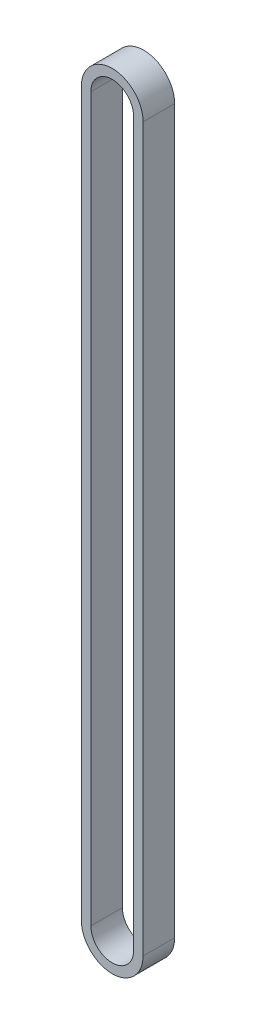
ISO-10303-21;
HEADER;
FILE_DESCRIPTION(('STEP AP214'),'2;1');
FILE_NAME('part.step','',(''),(''),'','','');
FILE_SCHEMA(('AUTOMOTIVE_DESIGN { 1 0 10303 214 1 1 1 1 }'));
ENDSEC;
DATA;
#1=APPLICATION_CONTEXT('core data for automotive mechanical design processes');
#2=APPLICATION_PROTOCOL_DEFINITION('international standard','automotive_design',2000,#1);
#3=PRODUCT_CONTEXT('',#1,'mechanical');
#4=PRODUCT('Part','Part','',(#3));
#5=PRODUCT_RELATED_PRODUCT_CATEGORY('part','',(#4));
#6=PRODUCT_DEFINITION_FORMATION('','',#4);
#7=PRODUCT_DEFINITION_CONTEXT('part definition',#1,'design');
#8=PRODUCT_DEFINITION('design','',#6,#7);
#9=PRODUCT_DEFINITION_SHAPE('','',#8);
#10=(LENGTH_UNIT() NAMED_UNIT(*) SI_UNIT(.MILLI.,.METRE.));
#11=(NAMED_UNIT(*) PLANE_ANGLE_UNIT() SI_UNIT($,.RADIAN.));
#12=(NAMED_UNIT(*) SI_UNIT($,.STERADIAN.) SOLID_ANGLE_UNIT());
#13=UNCERTAINTY_MEASURE_WITH_UNIT(LENGTH_MEASURE(1.E-05),#10,'distance_accuracy_value','');
#14=(GEOMETRIC_REPRESENTATION_CONTEXT(3) GLOBAL_UNCERTAINTY_ASSIGNED_CONTEXT((#13)) GLOBAL_UNIT_ASSIGNED_CONTEXT((#10,
#11,#12)) REPRESENTATION_CONTEXT('',''));
#15=CARTESIAN_POINT('',(0.,0.,0.));
#16=DIRECTION('',(0.,0.,1.));
#17=DIRECTION('',(1.,0.,0.));
#18=AXIS2_PLACEMENT_3D('',#15,#16,#17);
#19=CARTESIAN_POINT('',(0.,-114.5,10.));
#20=DIRECTION('',(0.,0.,1.));
#21=DIRECTION('',(1.,0.,0.));
#22=AXIS2_PLACEMENT_3D('',#19,#20,#21);
#23=PLANE('',#22);
#24=CARTESIAN_POINT('',(0.,-114.5,10.));
#25=DIRECTION('',(0.,0.,1.));
#26=DIRECTION('',(1.,0.,0.));
#27=AXIS2_PLACEMENT_3D('',#24,#25,#26);
#28=CIRCLE('',#27,9.78000000000004);
#29=CARTESIAN_POINT('',(-9.78000000000004,-114.5,10.));
#30=VERTEX_POINT('',#29);
#31=CARTESIAN_POINT('',(9.78000000000004,-114.5,10.));
#32=VERTEX_POINT('',#31);
#33=EDGE_CURVE('E157',#30,#32,#28,.T.);
#34=ORIENTED_EDGE('',*,*,#33,.T.);
#35=DIRECTION('',(0.,1.,0.));
#36=VECTOR('',#35,1.);
#37=CARTESIAN_POINT('',(9.78000000000004,-114.5,10.));
#38=LINE('',#37,#36);
#39=CARTESIAN_POINT('',(9.77999999999996,114.5,10.));
#40=VERTEX_POINT('',#39);
#41=EDGE_CURVE('E161',#32,#40,#38,.T.);
#42=ORIENTED_EDGE('',*,*,#41,.T.);
#43=CARTESIAN_POINT('',(0.,114.5,10.));
#44=DIRECTION('',(0.,0.,1.));
#45=DIRECTION('',(1.,0.,0.));
#46=AXIS2_PLACEMENT_3D('',#43,#44,#45);
#47=CIRCLE('',#46,9.78);
#48=CARTESIAN_POINT('',(-9.78000000000004,114.5,10.));
#49=VERTEX_POINT('',#48);
#50=EDGE_CURVE('E165',#40,#49,#47,.T.);
#51=ORIENTED_EDGE('',*,*,#50,.T.);
#52=DIRECTION('',(0.,-1.,0.));
#53=VECTOR('',#52,1.);
#54=CARTESIAN_POINT('',(-9.78000000000004,-114.5,10.));
#55=LINE('',#54,#53);
#56=EDGE_CURVE('E168',#49,#30,#55,.T.);
#57=ORIENTED_EDGE('',*,*,#56,.T.);
#58=EDGE_LOOP('',(#34,#42,#51,#57));
#59=FACE_BOUND('',#58,.T.);
#60=DIRECTION('',(0.,1.,0.));
#61=VECTOR('',#60,1.);
#62=CARTESIAN_POINT('',(6.78000000000004,-114.5,10.));
#63=LINE('',#62,#61);
#64=CARTESIAN_POINT('',(6.78000000000004,-114.5,10.));
#65=VERTEX_POINT('',#64);
#66=CARTESIAN_POINT('',(6.78,114.5,10.));
#67=VERTEX_POINT('',#66);
#68=EDGE_CURVE('E118',#65,#67,#63,.T.);
#69=ORIENTED_EDGE('',*,*,#68,.F.);
#70=CARTESIAN_POINT('',(0.,-114.5,10.));
#71=DIRECTION('',(0.,0.,1.));
#72=DIRECTION('',(1.,0.,0.));
#73=AXIS2_PLACEMENT_3D('',#70,#71,#72);
#74=CIRCLE('',#73,6.78000000000004);
#75=CARTESIAN_POINT('',(-6.78000000000004,-114.5,10.));
#76=VERTEX_POINT('',#75);
#77=EDGE_CURVE('E109',#76,#65,#74,.T.);
#78=ORIENTED_EDGE('',*,*,#77,.F.);
#79=DIRECTION('',(0.,-1.,0.));
#80=VECTOR('',#79,1.);
#81=CARTESIAN_POINT('',(-6.78000000000004,-114.5,10.));
#82=LINE('',#81,#80);
#83=CARTESIAN_POINT('',(-6.78000000000008,114.5,10.));
#84=VERTEX_POINT('',#83);
#85=EDGE_CURVE('E135',#84,#76,#82,.T.);
#86=ORIENTED_EDGE('',*,*,#85,.F.);
#87=CARTESIAN_POINT('',(0.,114.5,10.));
#88=DIRECTION('',(0.,0.,1.));
#89=DIRECTION('',(1.,0.,0.));
#90=AXIS2_PLACEMENT_3D('',#87,#88,#89);
#91=CIRCLE('',#90,6.78000000000004);
#92=EDGE_CURVE('E131',#67,#84,#91,.T.);
#93=ORIENTED_EDGE('',*,*,#92,.F.);
#94=EDGE_LOOP('',(#69,#78,#86,#93));
#95=FACE_BOUND('',#94,.T.);
#96=ADVANCED_FACE('F43',(#59,#95),#23,.T.);
#97=CARTESIAN_POINT('',(0.,-114.5,0.));
#98=DIRECTION('',(0.,0.,1.));
#99=DIRECTION('',(1.,0.,0.));
#100=AXIS2_PLACEMENT_3D('',#97,#98,#99);
#101=PLANE('',#100);
#102=CARTESIAN_POINT('',(0.,-114.5,0.));
#103=DIRECTION('',(0.,0.,1.));
#104=DIRECTION('',(1.,0.,0.));
#105=AXIS2_PLACEMENT_3D('',#102,#103,#104);
#106=CIRCLE('',#105,9.78000000000004);
#107=CARTESIAN_POINT('',(-9.78000000000004,-114.5,0.));
#108=VERTEX_POINT('',#107);
#109=CARTESIAN_POINT('',(9.78000000000004,-114.5,0.));
#110=VERTEX_POINT('',#109);
#111=EDGE_CURVE('E127',#108,#110,#106,.T.);
#112=ORIENTED_EDGE('',*,*,#111,.F.);
#113=DIRECTION('',(0.,-1.,0.));
#114=VECTOR('',#113,1.);
#115=CARTESIAN_POINT('',(-9.78000000000004,-114.5,0.));
#116=LINE('',#115,#114);
#117=CARTESIAN_POINT('',(-9.78000000000004,114.5,0.));
#118=VERTEX_POINT('',#117);
#119=EDGE_CURVE('E162',#118,#108,#116,.T.);
#120=ORIENTED_EDGE('',*,*,#119,.F.);
#121=CARTESIAN_POINT('',(0.,114.5,0.));
#122=DIRECTION('',(0.,0.,1.));
#123=DIRECTION('',(1.,0.,0.));
#124=AXIS2_PLACEMENT_3D('',#121,#122,#123);
#125=CIRCLE('',#124,9.78);
#126=CARTESIAN_POINT('',(9.77999999999996,114.5,0.));
#127=VERTEX_POINT('',#126);
#128=EDGE_CURVE('E178',#127,#118,#125,.T.);
#129=ORIENTED_EDGE('',*,*,#128,.F.);
#130=DIRECTION('',(0.,1.,0.));
#131=VECTOR('',#130,1.);
#132=CARTESIAN_POINT('',(9.78000000000004,-114.5,0.));
#133=LINE('',#132,#131);
#134=EDGE_CURVE('E175',#110,#127,#133,.T.);
#135=ORIENTED_EDGE('',*,*,#134,.F.);
#136=EDGE_LOOP('',(#112,#120,#129,#135));
#137=FACE_BOUND('',#136,.T.);
#138=CARTESIAN_POINT('',(0.,-114.5,0.));
#139=DIRECTION('',(0.,0.,1.));
#140=DIRECTION('',(1.,0.,0.));
#141=AXIS2_PLACEMENT_3D('',#138,#139,#140);
#142=CIRCLE('',#141,6.78000000000004);
#143=CARTESIAN_POINT('',(-6.78000000000004,-114.5,0.));
#144=VERTEX_POINT('',#143);
#145=CARTESIAN_POINT('',(6.78000000000004,-114.5,0.));
#146=VERTEX_POINT('',#145);
#147=EDGE_CURVE('E67',#144,#146,#142,.T.);
#148=ORIENTED_EDGE('',*,*,#147,.T.);
#149=DIRECTION('',(0.,1.,0.));
#150=VECTOR('',#149,1.);
#151=CARTESIAN_POINT('',(6.78000000000004,-114.5,0.));
#152=LINE('',#151,#150);
#153=CARTESIAN_POINT('',(6.78,114.5,0.));
#154=VERTEX_POINT('',#153);
#155=EDGE_CURVE('E125',#146,#154,#152,.T.);
#156=ORIENTED_EDGE('',*,*,#155,.T.);
#157=CARTESIAN_POINT('',(0.,114.5,0.));
#158=DIRECTION('',(0.,0.,1.));
#159=DIRECTION('',(1.,0.,0.));
#160=AXIS2_PLACEMENT_3D('',#157,#158,#159);
#161=CIRCLE('',#160,6.78000000000004);
#162=CARTESIAN_POINT('',(-6.78000000000008,114.5,0.));
#163=VERTEX_POINT('',#162);
#164=EDGE_CURVE('E144',#154,#163,#161,.T.);
#165=ORIENTED_EDGE('',*,*,#164,.T.);
#166=DIRECTION('',(0.,-1.,0.));
#167=VECTOR('',#166,1.);
#168=CARTESIAN_POINT('',(-6.78000000000004,-114.5,0.));
#169=LINE('',#168,#167);
#170=EDGE_CURVE('E119',#163,#144,#169,.T.);
#171=ORIENTED_EDGE('',*,*,#170,.T.);
#172=EDGE_LOOP('',(#148,#156,#165,#171));
#173=FACE_BOUND('',#172,.T.);
#174=ADVANCED_FACE('F201',(#137,#173),#101,.F.);
#175=CARTESIAN_POINT('',(0.,-114.5,10.));
#176=DIRECTION('',(0.,0.,-1.));
#177=DIRECTION('',(-1.,0.,0.));
#178=AXIS2_PLACEMENT_3D('',#175,#176,#177);
#179=CYLINDRICAL_SURFACE('',#178,9.78000000000004);
#180=ORIENTED_EDGE('',*,*,#111,.T.);
#181=DIRECTION('',(0.,0.,-1.));
#182=VECTOR('',#181,1.);
#183=CARTESIAN_POINT('',(9.78000000000004,-114.5,10.));
#184=LINE('',#183,#182);
#185=EDGE_CURVE('E11',#32,#110,#184,.T.);
#186=ORIENTED_EDGE('',*,*,#185,.F.);
#187=ORIENTED_EDGE('',*,*,#33,.F.);
#188=DIRECTION('',(0.,0.,-1.));
#189=VECTOR('',#188,1.);
#190=CARTESIAN_POINT('',(-9.78000000000004,-114.5,10.));
#191=LINE('',#190,#189);
#192=EDGE_CURVE('E171',#30,#108,#191,.T.);
#193=ORIENTED_EDGE('',*,*,#192,.T.);
#194=EDGE_LOOP('',(#180,#186,#187,#193));
#195=FACE_BOUND('',#194,.T.);
#196=ADVANCED_FACE('F45',(#195),#179,.T.);
#197=CARTESIAN_POINT('',(9.78000000000004,-114.5,10.));
#198=DIRECTION('',(-1.,0.,0.));
#199=DIRECTION('',(0.,-1.,0.));
#200=AXIS2_PLACEMENT_3D('',#197,#198,#199);
#201=PLANE('',#200);
#202=ORIENTED_EDGE('',*,*,#134,.T.);
#203=DIRECTION('',(0.,0.,-1.));
#204=VECTOR('',#203,1.);
#205=CARTESIAN_POINT('',(9.77999999999996,114.5,10.));
#206=LINE('',#205,#204);
#207=EDGE_CURVE('E52',#40,#127,#206,.T.);
#208=ORIENTED_EDGE('',*,*,#207,.F.);
#209=ORIENTED_EDGE('',*,*,#41,.F.);
#210=ORIENTED_EDGE('',*,*,#185,.T.);
#211=EDGE_LOOP('',(#202,#208,#209,#210));
#212=FACE_BOUND('',#211,.T.);
#213=ADVANCED_FACE('F211',(#212),#201,.F.);
#214=CARTESIAN_POINT('',(0.,114.5,10.));
#215=DIRECTION('',(0.,0.,-1.));
#216=DIRECTION('',(-1.,0.,0.));
#217=AXIS2_PLACEMENT_3D('',#214,#215,#216);
#218=CYLINDRICAL_SURFACE('',#217,9.78);
#219=ORIENTED_EDGE('',*,*,#128,.T.);
#220=DIRECTION('',(0.,0.,-1.));
#221=VECTOR('',#220,1.);
#222=CARTESIAN_POINT('',(-9.78000000000004,114.5,10.));
#223=LINE('',#222,#221);
#224=EDGE_CURVE('E186',#49,#118,#223,.T.);
#225=ORIENTED_EDGE('',*,*,#224,.F.);
#226=ORIENTED_EDGE('',*,*,#50,.F.);
#227=ORIENTED_EDGE('',*,*,#207,.T.);
#228=EDGE_LOOP('',(#219,#225,#226,#227));
#229=FACE_BOUND('',#228,.T.);
#230=ADVANCED_FACE('F195',(#229),#218,.T.);
#231=CARTESIAN_POINT('',(-9.78000000000004,-114.5,10.));
#232=DIRECTION('',(1.,0.,0.));
#233=DIRECTION('',(0.,0.,-1.));
#234=AXIS2_PLACEMENT_3D('',#231,#232,#233);
#235=PLANE('',#234);
#236=ORIENTED_EDGE('',*,*,#119,.T.);
#237=ORIENTED_EDGE('',*,*,#192,.F.);
#238=ORIENTED_EDGE('',*,*,#56,.F.);
#239=ORIENTED_EDGE('',*,*,#224,.T.);
#240=EDGE_LOOP('',(#236,#237,#238,#239));
#241=FACE_BOUND('',#240,.T.);
#242=ADVANCED_FACE('F205',(#241),#235,.F.);
#243=CARTESIAN_POINT('',(0.,-114.5,10.));
#244=DIRECTION('',(0.,0.,-1.));
#245=DIRECTION('',(-1.,0.,0.));
#246=AXIS2_PLACEMENT_3D('',#243,#244,#245);
#247=CYLINDRICAL_SURFACE('',#246,6.78000000000004);
#248=ORIENTED_EDGE('',*,*,#147,.F.);
#249=DIRECTION('',(0.,0.,-1.));
#250=VECTOR('',#249,1.);
#251=CARTESIAN_POINT('',(-6.78000000000004,-114.5,10.));
#252=LINE('',#251,#250);
#253=EDGE_CURVE('E113',#76,#144,#252,.T.);
#254=ORIENTED_EDGE('',*,*,#253,.F.);
#255=ORIENTED_EDGE('',*,*,#77,.T.);
#256=DIRECTION('',(0.,0.,-1.));
#257=VECTOR('',#256,1.);
#258=CARTESIAN_POINT('',(6.78000000000004,-114.5,10.));
#259=LINE('',#258,#257);
#260=EDGE_CURVE('E112',#65,#146,#259,.T.);
#261=ORIENTED_EDGE('',*,*,#260,.T.);
#262=EDGE_LOOP('',(#248,#254,#255,#261));
#263=FACE_BOUND('',#262,.T.);
#264=ADVANCED_FACE('F111',(#263),#247,.F.);
#265=CARTESIAN_POINT('',(6.78000000000004,-114.5,10.));
#266=DIRECTION('',(-1.,0.,0.));
#267=DIRECTION('',(0.,-1.,0.));
#268=AXIS2_PLACEMENT_3D('',#265,#266,#267);
#269=PLANE('',#268);
#270=ORIENTED_EDGE('',*,*,#155,.F.);
#271=ORIENTED_EDGE('',*,*,#260,.F.);
#272=ORIENTED_EDGE('',*,*,#68,.T.);
#273=DIRECTION('',(0.,0.,-1.));
#274=VECTOR('',#273,1.);
#275=CARTESIAN_POINT('',(6.78,114.5,10.));
#276=LINE('',#275,#274);
#277=EDGE_CURVE('E128',#67,#154,#276,.T.);
#278=ORIENTED_EDGE('',*,*,#277,.T.);
#279=EDGE_LOOP('',(#270,#271,#272,#278));
#280=FACE_BOUND('',#279,.T.);
#281=ADVANCED_FACE('F122',(#280),#269,.T.);
#282=CARTESIAN_POINT('',(0.,114.5,10.));
#283=DIRECTION('',(0.,0.,-1.));
#284=DIRECTION('',(-1.,0.,0.));
#285=AXIS2_PLACEMENT_3D('',#282,#283,#284);
#286=CYLINDRICAL_SURFACE('',#285,6.78000000000004);
#287=ORIENTED_EDGE('',*,*,#164,.F.);
#288=ORIENTED_EDGE('',*,*,#277,.F.);
#289=ORIENTED_EDGE('',*,*,#92,.T.);
#290=DIRECTION('',(0.,0.,-1.));
#291=VECTOR('',#290,1.);
#292=CARTESIAN_POINT('',(-6.78000000000008,114.5,10.));
#293=LINE('',#292,#291);
#294=EDGE_CURVE('E59',#84,#163,#293,.T.);
#295=ORIENTED_EDGE('',*,*,#294,.T.);
#296=EDGE_LOOP('',(#287,#288,#289,#295));
#297=FACE_BOUND('',#296,.T.);
#298=ADVANCED_FACE('F234',(#297),#286,.F.);
#299=CARTESIAN_POINT('',(-6.78000000000004,-114.5,10.));
#300=DIRECTION('',(1.,0.,0.));
#301=DIRECTION('',(0.,1.,0.));
#302=AXIS2_PLACEMENT_3D('',#299,#300,#301);
#303=PLANE('',#302);
#304=ORIENTED_EDGE('',*,*,#170,.F.);
#305=ORIENTED_EDGE('',*,*,#294,.F.);
#306=ORIENTED_EDGE('',*,*,#85,.T.);
#307=ORIENTED_EDGE('',*,*,#253,.T.);
#308=EDGE_LOOP('',(#304,#305,#306,#307));
#309=FACE_BOUND('',#308,.T.);
#310=ADVANCED_FACE('F238',(#309),#303,.T.);
#311=CLOSED_SHELL('',(#96,#174,#196,#213,#230,#242,#264,#281,#298,#310));
#312=MANIFOLD_SOLID_BREP('B2',#311);
#313=ADVANCED_BREP_SHAPE_REPRESENTATION('',(#18,#312),#14);
#314=SHAPE_DEFINITION_REPRESENTATION(#9,#313);
ENDSEC;
END-ISO-10303-21;
